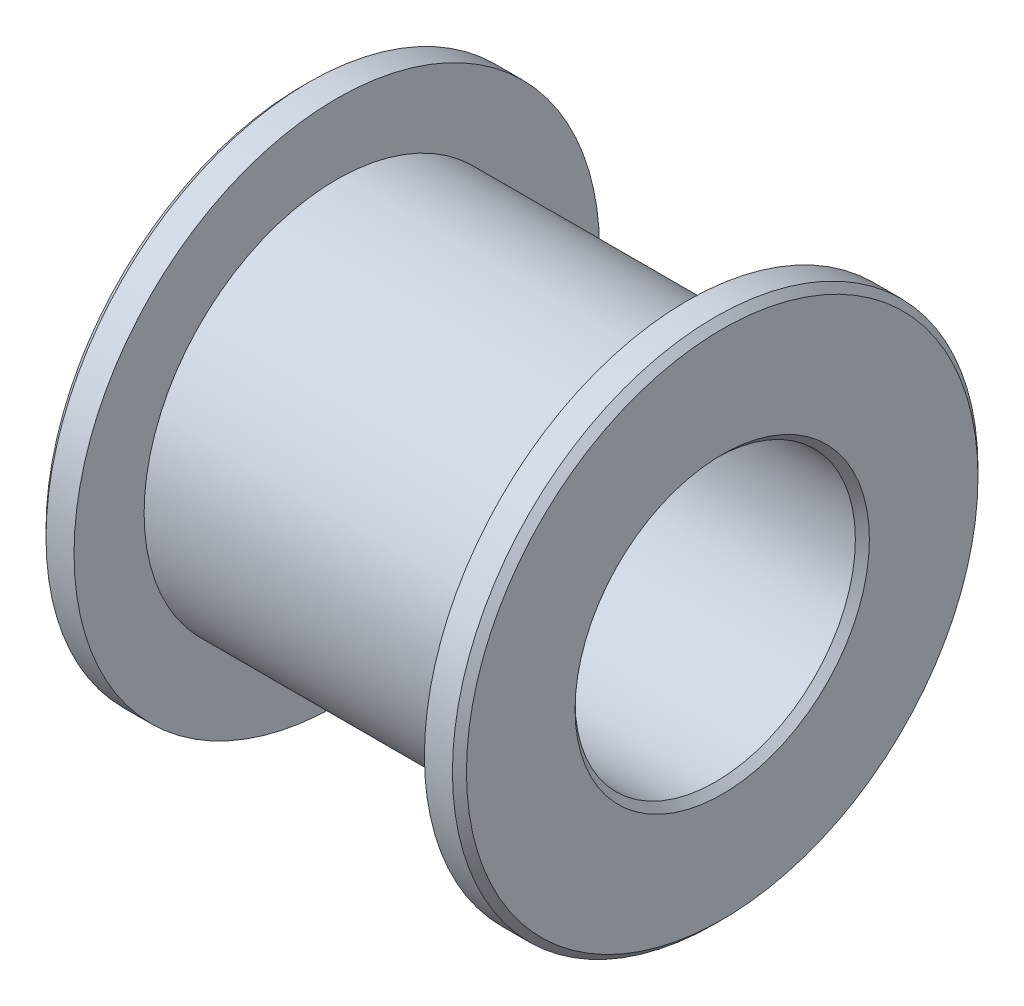
ISO-10303-21;
HEADER;
FILE_DESCRIPTION(('STEP AP214'),'2;1');
FILE_NAME('part.step','',(''),(''),'','','');
FILE_SCHEMA(('AUTOMOTIVE_DESIGN { 1 0 10303 214 1 1 1 1 }'));
ENDSEC;
DATA;
#1=APPLICATION_CONTEXT('core data for automotive mechanical design processes');
#2=APPLICATION_PROTOCOL_DEFINITION('international standard','automotive_design',2000,#1);
#3=PRODUCT_CONTEXT('',#1,'mechanical');
#4=PRODUCT('Part','Part','',(#3));
#5=PRODUCT_RELATED_PRODUCT_CATEGORY('part','',(#4));
#6=PRODUCT_DEFINITION_FORMATION('','',#4);
#7=PRODUCT_DEFINITION_CONTEXT('part definition',#1,'design');
#8=PRODUCT_DEFINITION('design','',#6,#7);
#9=PRODUCT_DEFINITION_SHAPE('','',#8);
#10=(LENGTH_UNIT() NAMED_UNIT(*) SI_UNIT(.MILLI.,.METRE.));
#11=(NAMED_UNIT(*) PLANE_ANGLE_UNIT() SI_UNIT($,.RADIAN.));
#12=(NAMED_UNIT(*) SI_UNIT($,.STERADIAN.) SOLID_ANGLE_UNIT());
#13=UNCERTAINTY_MEASURE_WITH_UNIT(LENGTH_MEASURE(1.E-05),#10,'distance_accuracy_value','');
#14=(GEOMETRIC_REPRESENTATION_CONTEXT(3) GLOBAL_UNCERTAINTY_ASSIGNED_CONTEXT((#13)) GLOBAL_UNIT_ASSIGNED_CONTEXT((#10,
#11,#12)) REPRESENTATION_CONTEXT('',''));
#15=CARTESIAN_POINT('',(0.,0.,0.));
#16=DIRECTION('',(0.,0.,1.));
#17=DIRECTION('',(1.,0.,0.));
#18=AXIS2_PLACEMENT_3D('',#15,#16,#17);
#19=CARTESIAN_POINT('',(-6.,0.,0.));
#20=DIRECTION('',(-1.,0.,0.));
#21=DIRECTION('',(0.,0.,1.));
#22=AXIS2_PLACEMENT_3D('',#19,#20,#21);
#23=CYLINDRICAL_SURFACE('',#22,5.5);
#24=CARTESIAN_POINT('',(0.,-3.83257569495583,3.94478941674125));
#25=CARTESIAN_POINT('',(0.0825564510277457,-3.83257779184317,3.94478849923233));
#26=CARTESIAN_POINT('',(0.16513210995551,-3.83768657177446,3.93984343512826));
#27=CARTESIAN_POINT('',(0.327893525300006,-3.85779985809754,3.92014947845345));
#28=CARTESIAN_POINT('',(0.408078135498548,-3.87280903328307,3.90539596042047));
#29=CARTESIAN_POINT('',(0.563679187961851,-3.91177142994483,3.86636748364182));
#30=CARTESIAN_POINT('',(0.639102360904223,-3.93571167988186,3.84210633126646));
#31=CARTESIAN_POINT('',(0.783358134236701,-3.99119472858773,3.78443644979051));
#32=CARTESIAN_POINT('',(0.852190136237295,-4.02273821671555,3.7510268911986));
#33=CARTESIAN_POINT('',(0.983110206791341,-4.09265249494127,3.67463366794366));
#34=CARTESIAN_POINT('',(1.04500032837805,-4.13116708301854,3.63144229944174));
#35=CARTESIAN_POINT('',(1.15852765772549,-4.21264703857915,3.53659550067493));
#36=CARTESIAN_POINT('',(1.21016376091601,-4.25561288479744,3.48493915964987));
#37=CARTESIAN_POINT('',(1.30254862681048,-4.34483481221414,3.37307079648808));
#38=CARTESIAN_POINT('',(1.34309972182645,-4.39113406996652,3.31272951759214));
#39=CARTESIAN_POINT('',(1.41087286818287,-4.48435294719107,3.18540330756704));
#40=CARTESIAN_POINT('',(1.43809727457422,-4.53127245554832,3.11841955279337));
#41=CARTESIAN_POINT('',(1.47780109828054,-4.62271849092706,2.9811258261359));
#42=CARTESIAN_POINT('',(1.49061744421473,-4.66727541013824,2.91093364868071));
#43=CARTESIAN_POINT('',(1.50220230229795,-4.75359168787942,2.76773372344523));
#44=CARTESIAN_POINT('',(1.50097326954448,-4.79535153404728,2.69472646995676));
#45=CARTESIAN_POINT('',(1.4847376013516,-4.87379253324529,2.55004783493598));
#46=CARTESIAN_POINT('',(1.47009512668074,-4.91057857065796,2.47839199233658));
#47=CARTESIAN_POINT('',(1.42803766765441,-4.97958496772767,2.3366537172284));
#48=CARTESIAN_POINT('',(1.40062193867166,-5.01180506106644,2.2665713766979));
#49=CARTESIAN_POINT('',(1.33352286415698,-5.07161811280774,2.12940152962072));
#50=CARTESIAN_POINT('',(1.2937165513123,-5.09916021069649,2.0623521227574));
#51=CARTESIAN_POINT('',(1.2030611057326,-5.14918273732886,1.93407963863881));
#52=CARTESIAN_POINT('',(1.15220973562866,-5.17166213865305,1.87285774546715));
#53=CARTESIAN_POINT('',(1.03898200487914,-5.21241257394092,1.75632900786158));
#54=CARTESIAN_POINT('',(0.976288328059216,-5.23052551927844,1.70127483626013));
#55=CARTESIAN_POINT('',(0.842154784886653,-5.26196774843585,1.6013884873768));
#56=CARTESIAN_POINT('',(0.770714333813611,-5.27529671221295,1.55655699405333));
#57=CARTESIAN_POINT('',(0.62044560599964,-5.2976737905369,1.47861926521595));
#58=CARTESIAN_POINT('',(0.541570994225794,-5.30669259484379,1.4455936849244));
#59=CARTESIAN_POINT('',(0.379077397770891,-5.32069441111388,1.39318165748244));
#60=CARTESIAN_POINT('',(0.295459658367184,-5.32567847717164,1.37379164814821));
#61=CARTESIAN_POINT('',(0.128647818490018,-5.33176511115863,1.34997343711764));
#62=CARTESIAN_POINT('',(0.0455218132358918,-5.3329838674859,1.34509754334896));
#63=CARTESIAN_POINT('',(-0.120351143542063,-5.33192993492103,1.34926947436423));
#64=CARTESIAN_POINT('',(-0.203098136486285,-5.32965763714367,1.3583157394011));
#65=CARTESIAN_POINT('',(-0.364122437311363,-5.32159308032032,1.389566813264));
#66=CARTESIAN_POINT('',(-0.442456420629789,-5.31587334351316,1.41150028662097));
#67=CARTESIAN_POINT('',(-0.594346009930619,-5.30072833446568,1.46734823631553));
#68=CARTESIAN_POINT('',(-0.667900969377689,-5.29130256206169,1.50126432975554));
#69=CARTESIAN_POINT('',(-0.810000708166988,-5.26814066052611,1.58064407405473));
#70=CARTESIAN_POINT('',(-0.878392574504979,-5.25431094924648,1.62635390892326));
#71=CARTESIAN_POINT('',(-1.00656606538514,-5.22201529862214,1.72723943956769));
#72=CARTESIAN_POINT('',(-1.06634599010013,-5.20354844596504,1.78241699938923));
#73=CARTESIAN_POINT('',(-1.1774663639506,-5.16099178744657,1.90218730711986));
#74=CARTESIAN_POINT('',(-1.2284950034342,-5.13674810887495,1.96701528554917));
#75=CARTESIAN_POINT('',(-1.31837063509098,-5.08276687255975,2.10256866694204));
#76=CARTESIAN_POINT('',(-1.35721827532782,-5.05302960722435,2.17329375590911));
#77=CARTESIAN_POINT('',(-1.42126706625792,-4.98841794761999,2.31773412983819));
#78=CARTESIAN_POINT('',(-1.44657089030049,-4.95358482891295,2.39142222867928));
#79=CARTESIAN_POINT('',(-1.48310695254508,-4.87913875030187,2.53986026370147));
#80=CARTESIAN_POINT('',(-1.49434246382693,-4.83952690455033,2.61460994880349));
#81=CARTESIAN_POINT('',(-1.50221012009057,-4.75784127197925,2.76038132972215));
#82=CARTESIAN_POINT('',(-1.49929867130671,-4.71588704715573,2.83144573146195));
#83=CARTESIAN_POINT('',(-1.48002022269001,-4.62969748531677,2.97028243750669));
#84=CARTESIAN_POINT('',(-1.46365377006972,-4.58546224113854,3.03805487557647));
#85=CARTESIAN_POINT('',(-1.41819262966053,-4.49659898831466,3.1680843493329));
#86=CARTESIAN_POINT('',(-1.38919430175976,-4.45197641180414,3.23037893053933));
#87=CARTESIAN_POINT('',(-1.3193783784649,-4.36367807066707,3.34869669213298));
#88=CARTESIAN_POINT('',(-1.27855906819338,-4.32000244440403,3.40471896095561));
#89=CARTESIAN_POINT('',(-1.1849452717183,-4.23415532924359,3.51094358956479));
#90=CARTESIAN_POINT('',(-1.13185092756335,-4.19205880123145,3.5609422429786));
#91=CARTESIAN_POINT('',(-1.01575786144977,-4.11255082675171,3.65247989433586));
#92=CARTESIAN_POINT('',(-0.952756497048733,-4.07514063504016,3.69401662847581));
#93=CARTESIAN_POINT('',(-0.816872473169076,-4.00601807281623,3.76888331769936));
#94=CARTESIAN_POINT('',(-0.743793797319194,-3.97445875509385,3.80199952684741));
#95=CARTESIAN_POINT('',(-0.590914054850382,-3.91992599330998,3.85820213250577));
#96=CARTESIAN_POINT('',(-0.511117229489693,-3.89694718133543,3.88129480115678));
#97=CARTESIAN_POINT('',(-0.359731980747443,-3.86374899765198,3.91432005982005));
#98=CARTESIAN_POINT('',(-0.288771531248475,-3.85210977434421,3.92573149072156));
#99=CARTESIAN_POINT('',(-0.145212202097287,-3.83652268745774,3.9409660925748));
#100=CARTESIAN_POINT('',(-0.0726135309486981,-3.83257385061306,3.94479022374739));
#101=CARTESIAN_POINT('',(0.,-3.83257569495583,3.94478941674125));
#102=B_SPLINE_CURVE_WITH_KNOTS('',3,(#24,#25,#26,#27,#28,#29,#30,#31,#32,#33,#34,#35,#36,#37,
#38,#39,#40,#41,#42,#43,#44,#45,#46,#47,#48,#49,#50,#51,#52,#53,#54,#55,#56,#57,#58,#59,#60,#61,
#62,#63,#64,#65,#66,#67,#68,#69,#70,#71,#72,#73,#74,#75,#76,#77,#78,#79,#80,#81,#82,#83,#84,#85,
#86,#87,#88,#89,#90,#91,#92,#93,#94,#95,#96,#97,#98,#99,#100,#101),.UNSPECIFIED.,.T.,.F.,(4,2,2,
2,2,2,2,2,2,2,2,2,2,2,2,2,2,2,2,2,2,2,2,2,2,2,2,2,2,2,2,2,2,2,2,2,2,2,4),(0.,0.247402201391968,
0.494921155336742,0.742082002291411,0.989265266888852,1.24229327000825,1.49534851471804,
1.75265882819585,2.00992365416646,2.26103843021061,2.51210931268384,2.75655962385663,
3.0010241872433,3.24799669713117,3.49501928234234,3.74996416866223,4.00492610732058,
4.26159801830625,4.51820285087414,4.76680611540842,5.01538153009582,5.25890187447337,
5.50245509545498,5.75157425489228,6.0007425183582,6.25748556676548,6.51421495339717,
6.76896951768223,7.02366480072505,7.27019876040454,7.51672269408902,7.76139812559489,
8.00610907011738,8.25758505394755,8.50912822664454,8.76653181226181,9.02377409687474,
9.24140725781327,9.45901287413893),.UNSPECIFIED.);
#103=CARTESIAN_POINT('',(0.,-3.83257569495583,3.94478941674125));
#104=VERTEX_POINT('',#103);
#105=EDGE_CURVE('E86',#104,#104,#102,.T.);
#106=ORIENTED_EDGE('',*,*,#105,.T.);
#107=EDGE_LOOP('',(#106));
#108=FACE_BOUND('',#107,.T.);
#109=CARTESIAN_POINT('',(-5.,0.,0.));
#110=DIRECTION('',(-1.,0.,0.));
#111=DIRECTION('',(0.,0.,1.));
#112=AXIS2_PLACEMENT_3D('',#109,#110,#111);
#113=CIRCLE('',#112,5.5);
#114=CARTESIAN_POINT('',(-5.,0.,5.5));
#115=VERTEX_POINT('',#114);
#116=EDGE_CURVE('E74',#115,#115,#113,.T.);
#117=ORIENTED_EDGE('',*,*,#116,.F.);
#118=EDGE_LOOP('',(#117));
#119=FACE_BOUND('',#118,.T.);
#120=CARTESIAN_POINT('',(5.,0.,0.));
#121=DIRECTION('',(-1.,0.,0.));
#122=DIRECTION('',(0.,0.,1.));
#123=AXIS2_PLACEMENT_3D('',#120,#121,#122);
#124=CIRCLE('',#123,5.5);
#125=CARTESIAN_POINT('',(5.,0.,5.5));
#126=VERTEX_POINT('',#125);
#127=EDGE_CURVE('E80',#126,#126,#124,.T.);
#128=ORIENTED_EDGE('',*,*,#127,.T.);
#129=EDGE_LOOP('',(#128));
#130=FACE_BOUND('',#129,.T.);
#131=ADVANCED_FACE('F36',(#108,#119,#130),#23,.T.);
#132=CARTESIAN_POINT('',(-5.,5.5,0.));
#133=DIRECTION('',(-1.,0.,0.));
#134=DIRECTION('',(0.,0.,1.));
#135=AXIS2_PLACEMENT_3D('',#132,#133,#134);
#136=PLANE('',#135);
#137=CARTESIAN_POINT('',(-5.,0.,0.));
#138=DIRECTION('',(-1.,0.,0.));
#139=DIRECTION('',(0.,0.,1.));
#140=AXIS2_PLACEMENT_3D('',#137,#138,#139);
#141=CIRCLE('',#140,7.5);
#142=CARTESIAN_POINT('',(-5.,0.,7.5));
#143=VERTEX_POINT('',#142);
#144=EDGE_CURVE('E77',#143,#143,#141,.T.);
#145=ORIENTED_EDGE('',*,*,#144,.F.);
#146=EDGE_LOOP('',(#145));
#147=FACE_BOUND('',#146,.T.);
#148=ORIENTED_EDGE('',*,*,#116,.T.);
#149=EDGE_LOOP('',(#148));
#150=FACE_BOUND('',#149,.T.);
#151=ADVANCED_FACE('F124',(#147,#150),#136,.F.);
#152=CARTESIAN_POINT('',(-6.,0.,0.));
#153=DIRECTION('',(-1.,0.,0.));
#154=DIRECTION('',(0.,0.,1.));
#155=AXIS2_PLACEMENT_3D('',#152,#153,#154);
#156=CYLINDRICAL_SURFACE('',#155,7.5);
#157=CARTESIAN_POINT('',(-5.8,0.,0.));
#158=DIRECTION('',(1.,0.,0.));
#159=DIRECTION('',(0.,0.,-1.));
#160=AXIS2_PLACEMENT_3D('',#157,#158,#159);
#161=CIRCLE('',#160,7.5);
#162=CARTESIAN_POINT('',(-5.8,0.,-7.5));
#163=VERTEX_POINT('',#162);
#164=EDGE_CURVE('E10',#163,#163,#161,.T.);
#165=ORIENTED_EDGE('',*,*,#164,.T.);
#166=EDGE_LOOP('',(#165));
#167=FACE_BOUND('',#166,.T.);
#168=ORIENTED_EDGE('',*,*,#144,.T.);
#169=EDGE_LOOP('',(#168));
#170=FACE_BOUND('',#169,.T.);
#171=ADVANCED_FACE('F121',(#167,#170),#156,.T.);
#172=CARTESIAN_POINT('',(-6.,7.5,0.));
#173=DIRECTION('',(1.,0.,0.));
#174=DIRECTION('',(0.,0.,-1.));
#175=AXIS2_PLACEMENT_3D('',#172,#173,#174);
#176=PLANE('',#175);
#177=CARTESIAN_POINT('',(-6.,0.,0.));
#178=DIRECTION('',(1.,0.,0.));
#179=DIRECTION('',(0.,0.,-1.));
#180=AXIS2_PLACEMENT_3D('',#177,#178,#179);
#181=CIRCLE('',#180,4.2);
#182=CARTESIAN_POINT('',(-6.,0.,-4.2));
#183=VERTEX_POINT('',#182);
#184=EDGE_CURVE('E54',#183,#183,#181,.T.);
#185=ORIENTED_EDGE('',*,*,#184,.T.);
#186=EDGE_LOOP('',(#185));
#187=FACE_BOUND('',#186,.T.);
#188=CARTESIAN_POINT('',(-6.,0.,0.));
#189=DIRECTION('',(1.,0.,0.));
#190=DIRECTION('',(0.,0.,-1.));
#191=AXIS2_PLACEMENT_3D('',#188,#189,#190);
#192=CIRCLE('',#191,7.3);
#193=CARTESIAN_POINT('',(-6.,0.,-7.3));
#194=VERTEX_POINT('',#193);
#195=EDGE_CURVE('E59',#194,#194,#192,.F.);
#196=ORIENTED_EDGE('',*,*,#195,.T.);
#197=EDGE_LOOP('',(#196));
#198=FACE_BOUND('',#197,.T.);
#199=ADVANCED_FACE('F117',(#187,#198),#176,.F.);
#200=CARTESIAN_POINT('',(5.,5.5,0.));
#201=DIRECTION('',(1.,0.,0.));
#202=DIRECTION('',(0.,0.,1.));
#203=AXIS2_PLACEMENT_3D('',#200,#201,#202);
#204=PLANE('',#203);
#205=CARTESIAN_POINT('',(5.,0.,0.));
#206=DIRECTION('',(-1.,0.,0.));
#207=DIRECTION('',(0.,0.,1.));
#208=AXIS2_PLACEMENT_3D('',#205,#206,#207);
#209=CIRCLE('',#208,7.5);
#210=CARTESIAN_POINT('',(5.,0.,7.5));
#211=VERTEX_POINT('',#210);
#212=EDGE_CURVE('E83',#211,#211,#209,.T.);
#213=ORIENTED_EDGE('',*,*,#212,.T.);
#214=EDGE_LOOP('',(#213));
#215=FACE_BOUND('',#214,.T.);
#216=ORIENTED_EDGE('',*,*,#127,.F.);
#217=EDGE_LOOP('',(#216));
#218=FACE_BOUND('',#217,.T.);
#219=ADVANCED_FACE('F113',(#215,#218),#204,.F.);
#220=CARTESIAN_POINT('',(6.,0.,0.));
#221=DIRECTION('',(1.,0.,0.));
#222=DIRECTION('',(0.,0.,1.));
#223=AXIS2_PLACEMENT_3D('',#220,#221,#222);
#224=CYLINDRICAL_SURFACE('',#223,7.5);
#225=CARTESIAN_POINT('',(5.8,0.,0.));
#226=DIRECTION('',(-1.,0.,0.));
#227=DIRECTION('',(0.,0.,1.));
#228=AXIS2_PLACEMENT_3D('',#225,#226,#227);
#229=CIRCLE('',#228,7.5);
#230=CARTESIAN_POINT('',(5.8,0.,7.5));
#231=VERTEX_POINT('',#230);
#232=EDGE_CURVE('E50',#231,#231,#229,.T.);
#233=ORIENTED_EDGE('',*,*,#232,.T.);
#234=EDGE_LOOP('',(#233));
#235=FACE_BOUND('',#234,.T.);
#236=ORIENTED_EDGE('',*,*,#212,.F.);
#237=EDGE_LOOP('',(#236));
#238=FACE_BOUND('',#237,.T.);
#239=ADVANCED_FACE('F109',(#235,#238),#224,.T.);
#240=CARTESIAN_POINT('',(6.,7.5,0.));
#241=DIRECTION('',(-1.,0.,0.));
#242=DIRECTION('',(0.,0.,-1.));
#243=AXIS2_PLACEMENT_3D('',#240,#241,#242);
#244=PLANE('',#243);
#245=CARTESIAN_POINT('',(6.,0.,0.));
#246=DIRECTION('',(-1.,0.,0.));
#247=DIRECTION('',(0.,0.,1.));
#248=AXIS2_PLACEMENT_3D('',#245,#246,#247);
#249=CIRCLE('',#248,4.2);
#250=CARTESIAN_POINT('',(6.,0.,4.2));
#251=VERTEX_POINT('',#250);
#252=EDGE_CURVE('E68',#251,#251,#249,.T.);
#253=ORIENTED_EDGE('',*,*,#252,.T.);
#254=EDGE_LOOP('',(#253));
#255=FACE_BOUND('',#254,.T.);
#256=CARTESIAN_POINT('',(6.,0.,0.));
#257=DIRECTION('',(-1.,0.,0.));
#258=DIRECTION('',(0.,0.,1.));
#259=AXIS2_PLACEMENT_3D('',#256,#257,#258);
#260=CIRCLE('',#259,7.3);
#261=CARTESIAN_POINT('',(6.,0.,7.3));
#262=VERTEX_POINT('',#261);
#263=EDGE_CURVE('E71',#262,#262,#260,.F.);
#264=ORIENTED_EDGE('',*,*,#263,.T.);
#265=EDGE_LOOP('',(#264));
#266=FACE_BOUND('',#265,.T.);
#267=ADVANCED_FACE('F105',(#255,#266),#244,.F.);
#268=CARTESIAN_POINT('',(6.,0.,0.));
#269=DIRECTION('',(-1.,0.,0.));
#270=DIRECTION('',(0.,0.,1.));
#271=AXIS2_PLACEMENT_3D('',#268,#269,#270);
#272=CYLINDRICAL_SURFACE('',#271,4.);
#273=CARTESIAN_POINT('',(0.,-2.46130814466628,3.15308772745058));
#274=CARTESIAN_POINT('',(-0.0810074837207897,-2.46130416703999,3.15308894248185));
#275=CARTESIAN_POINT('',(-0.161994922503636,-2.46692401386083,3.14872747440101));
#276=CARTESIAN_POINT('',(-0.321528082913202,-2.48893953169064,3.13135346024446));
#277=CARTESIAN_POINT('',(-0.400073877595011,-2.50533487996613,3.11834117326643));
#278=CARTESIAN_POINT('',(-0.552375371613527,-2.54763559103675,3.08387532277158));
#279=CARTESIAN_POINT('',(-0.626142056651083,-2.57351816157599,3.06244198133433));
#280=CARTESIAN_POINT('',(-0.76737189681884,-2.63314003803974,3.01133035480329));
#281=CARTESIAN_POINT('',(-0.83483315028252,-2.6668817035576,2.98164959300885));
#282=CARTESIAN_POINT('',(-0.964890311622817,-2.74204097254054,2.91271721243845));
#283=CARTESIAN_POINT('',(-1.02712852962939,-2.78373657182072,2.87309366119098));
#284=CARTESIAN_POINT('',(-1.14172281467149,-2.87154547447213,2.78533235454073));
#285=CARTESIAN_POINT('',(-1.19407677374185,-2.91765971703069,2.7371927872015));
#286=CARTESIAN_POINT('',(-1.28913951229561,-3.01376028398765,2.63107154503124));
#287=CARTESIAN_POINT('',(-1.33145947471586,-3.06382497112885,2.57281070897668));
#288=CARTESIAN_POINT('',(-1.40265117252491,-3.16397597332787,2.44859301974589));
#289=CARTESIAN_POINT('',(-1.43152757199197,-3.21406227484147,2.3826388456243));
#290=CARTESIAN_POINT('',(-1.47375789577462,-3.30985861192705,2.24753066034174));
#291=CARTESIAN_POINT('',(-1.48772762744046,-3.35566422563199,2.17863737235961));
#292=CARTESIAN_POINT('',(-1.50172120094499,-3.44342381167713,2.03709528834153));
#293=CARTESIAN_POINT('',(-1.50174957761871,-3.48537903203104,1.96444772118504));
#294=CARTESIAN_POINT('',(-1.48821823853483,-3.56215651743457,1.82134924536859));
#295=CARTESIAN_POINT('',(-1.47533070205119,-3.59722898362323,1.75096747383887));
#296=CARTESIAN_POINT('',(-1.43746408477445,-3.66204439904788,1.61101853992129));
#297=CARTESIAN_POINT('',(-1.41248414773796,-3.69178697067825,1.54145143557603));
#298=CARTESIAN_POINT('',(-1.35082954832415,-3.74615784257056,1.40421966684579));
#299=CARTESIAN_POINT('',(-1.31398999473159,-3.77070542200687,1.3365974181102));
#300=CARTESIAN_POINT('',(-1.22980790307061,-3.81438289074645,1.20632123821128));
#301=CARTESIAN_POINT('',(-1.1824619769824,-3.83351102788629,1.14366891858216));
#302=CARTESIAN_POINT('',(-1.07537271371681,-3.86785822217229,1.02172363584089));
#303=CARTESIAN_POINT('',(-1.01506608434957,-3.88278307121918,0.962841721157713));
#304=CARTESIAN_POINT('',(-0.885407006678441,-3.90798892180928,0.854813844924447));
#305=CARTESIAN_POINT('',(-0.816052293413361,-3.9182687577042,0.805670328923489));
#306=CARTESIAN_POINT('',(-0.668280532537177,-3.93525577063681,0.718191134485137));
#307=CARTESIAN_POINT('',(-0.589696506313933,-3.94187858478667,0.680119556887318));
#308=CARTESIAN_POINT('',(-0.426903774832427,-3.95205044065656,0.618296615287921));
#309=CARTESIAN_POINT('',(-0.342698228406309,-3.95560119322117,0.594537282976517));
#310=CARTESIAN_POINT('',(-0.176024037684047,-3.96011415400145,0.563673025953814));
#311=CARTESIAN_POINT('',(-0.093715894463859,-3.96120837256408,0.555721544182528));
#312=CARTESIAN_POINT('',(0.0710093567417423,-3.96139505428122,0.554393287633167));
#313=CARTESIAN_POINT('',(0.153426432352471,-3.96048801766269,0.561012870720206));
#314=CARTESIAN_POINT('',(0.31192992228768,-3.95660422459683,0.587748090151342));
#315=CARTESIAN_POINT('',(0.38813113576466,-3.95372775968472,0.607208165259563));
#316=CARTESIAN_POINT('',(0.536347944720194,-3.94559961270876,0.657950745391574));
#317=CARTESIAN_POINT('',(0.608362679168135,-3.94034744397206,0.68923567256969));
#318=CARTESIAN_POINT('',(0.749164438076205,-3.92662341308151,0.763613608674909));
#319=CARTESIAN_POINT('',(0.817729292137339,-3.91803824396033,0.807105273304065));
#320=CARTESIAN_POINT('',(0.947128981726039,-3.89691377193743,0.903603640175327));
#321=CARTESIAN_POINT('',(1.00796097462463,-3.88437302081242,0.956613824284626));
#322=CARTESIAN_POINT('',(1.1241683731951,-3.85363227625703,1.0739740348992));
#323=CARTESIAN_POINT('',(1.17895340876875,-3.83512392463583,1.13882989634834));
#324=CARTESIAN_POINT('',(1.27683836758944,-3.79201627396768,1.27503264962599));
#325=CARTESIAN_POINT('',(1.31993825294584,-3.76741695517046,1.3463795625016));
#326=CARTESIAN_POINT('',(1.39294605619961,-3.711791364052,1.49288848445759));
#327=CARTESIAN_POINT('',(1.4228991237926,-3.68078763446489,1.56803643199574));
#328=CARTESIAN_POINT('',(1.46865641384992,-3.61240518346287,1.71971941896856));
#329=CARTESIAN_POINT('',(1.4844672854224,-3.5750294677586,1.79625378927443));
#330=CARTESIAN_POINT('',(1.50077440275483,-3.49701542235705,1.94355975996712));
#331=CARTESIAN_POINT('',(1.50210948305899,-3.45669418700059,2.01440726096226));
#332=CARTESIAN_POINT('',(1.49158484055461,-3.3722592876295,2.15277337371414));
#333=CARTESIAN_POINT('',(1.47972670911414,-3.32814608159537,2.22029238592815));
#334=CARTESIAN_POINT('',(1.44374114850638,-3.23882359879593,2.34861476220779));
#335=CARTESIAN_POINT('',(1.41992009412164,-3.19366731525059,2.40954177507423));
#336=CARTESIAN_POINT('',(1.36098998661564,-3.10293681149968,2.52531146222657));
#337=CARTESIAN_POINT('',(1.32587879669525,-3.0573625137672,2.58015298211198));
#338=CARTESIAN_POINT('',(1.24368605649519,-2.96567401779907,2.68511428848657));
#339=CARTESIAN_POINT('',(1.19616335948585,-2.91961765634593,2.73493868271024));
#340=CARTESIAN_POINT('',(1.09119216981239,-2.83097524837746,2.8265971887372));
#341=CARTESIAN_POINT('',(1.03374013419212,-2.78839044858359,2.868428437194));
#342=CARTESIAN_POINT('',(0.906935868354939,-2.70661009558998,2.9457763929428));
#343=CARTESIAN_POINT('',(0.837115597845688,-2.66771204811978,2.98084329967611));
#344=CARTESIAN_POINT('',(0.689584130426674,-2.59834374399289,3.04150311994833));
#345=CARTESIAN_POINT('',(0.611872115946517,-2.56787436175086,3.06709505061834));
#346=CARTESIAN_POINT('',(0.447044319024593,-2.5164290803657,3.1094623762281));
#347=CARTESIAN_POINT('',(0.359665633488215,-2.49592793682217,3.12580206721063));
#348=CARTESIAN_POINT('',(0.181514728044213,-2.46837413297852,3.14761047631873));
#349=CARTESIAN_POINT('',(0.0907447872900077,-2.46131260041326,3.15308636636948));
#350=CARTESIAN_POINT('',(0.,-2.46130814466628,3.15308772745058));
#351=B_SPLINE_CURVE_WITH_KNOTS('',3,(#273,#274,#275,#276,#277,#278,#279,#280,#281,#282,#283,
#284,#285,#286,#287,#288,#289,#290,#291,#292,#293,#294,#295,#296,#297,#298,#299,#300,#301,#302,
#303,#304,#305,#306,#307,#308,#309,#310,#311,#312,#313,#314,#315,#316,#317,#318,#319,#320,#321,
#322,#323,#324,#325,#326,#327,#328,#329,#330,#331,#332,#333,#334,#335,#336,#337,#338,#339,#340,
#341,#342,#343,#344,#345,#346,#347,#348,#349,#350),.UNSPECIFIED.,.T.,.F.,(4,2,2,2,2,2,2,2,2,2,2,
2,2,2,2,2,2,2,2,2,2,2,2,2,2,2,2,2,2,2,2,2,2,2,2,2,2,2,4),(0.,0.24268454141617,0.485361814598854,
0.72745985675703,0.969630679682933,1.22274652401128,1.47591628822983,1.73770072136421,
1.9993942638133,2.24980018489679,2.50012465404857,2.73806472803194,2.97602165263335,
3.21744131210668,3.45893893628976,3.71456675065874,3.97025867827335,4.23162592252966,
4.49284751635474,4.73965657740485,4.98640395388884,5.22143845928199,5.45652113429526,
5.70041561005821,5.94439948466355,6.20385016993624,6.46330169650178,6.72185508890168,
6.98028685560127,7.22365720549936,7.46699820319479,7.7044027400389,7.94185223512831,
8.18928323676987,8.43680270894964,8.69738599542079,8.95799630544242,9.23003178870926,
9.50188762323053),.UNSPECIFIED.);
#352=CARTESIAN_POINT('',(0.,-2.46130814466628,3.15308772745058));
#353=VERTEX_POINT('',#352);
#354=EDGE_CURVE('E41',#353,#353,#351,.T.);
#355=ORIENTED_EDGE('',*,*,#354,.T.);
#356=EDGE_LOOP('',(#355));
#357=FACE_BOUND('',#356,.T.);
#358=CARTESIAN_POINT('',(5.8,0.,0.));
#359=DIRECTION('',(-1.,0.,0.));
#360=DIRECTION('',(0.,0.,1.));
#361=AXIS2_PLACEMENT_3D('',#358,#359,#360);
#362=CIRCLE('',#361,4.);
#363=CARTESIAN_POINT('',(5.8,0.,4.));
#364=VERTEX_POINT('',#363);
#365=EDGE_CURVE('E62',#364,#364,#362,.F.);
#366=ORIENTED_EDGE('',*,*,#365,.T.);
#367=EDGE_LOOP('',(#366));
#368=FACE_BOUND('',#367,.T.);
#369=CARTESIAN_POINT('',(-5.8,0.,0.));
#370=DIRECTION('',(1.,0.,0.));
#371=DIRECTION('',(0.,0.,-1.));
#372=AXIS2_PLACEMENT_3D('',#369,#370,#371);
#373=CIRCLE('',#372,4.);
#374=CARTESIAN_POINT('',(-5.8,0.,-4.));
#375=VERTEX_POINT('',#374);
#376=EDGE_CURVE('E65',#375,#375,#373,.F.);
#377=ORIENTED_EDGE('',*,*,#376,.T.);
#378=EDGE_LOOP('',(#377));
#379=FACE_BOUND('',#378,.T.);
#380=ADVANCED_FACE('F99',(#357,#368,#379),#272,.F.);
#381=CARTESIAN_POINT('',(6.,0.,0.));
#382=DIRECTION('',(1.,0.,0.));
#383=DIRECTION('',(0.,0.,-1.));
#384=AXIS2_PLACEMENT_3D('',#381,#382,#383);
#385=CONICAL_SURFACE('',#384,4.2,0.785398163397444);
#386=ORIENTED_EDGE('',*,*,#365,.F.);
#387=EDGE_LOOP('',(#386));
#388=FACE_BOUND('',#387,.T.);
#389=ORIENTED_EDGE('',*,*,#252,.F.);
#390=EDGE_LOOP('',(#389));
#391=FACE_BOUND('',#390,.T.);
#392=ADVANCED_FACE('F104',(#388,#391),#385,.F.);
#393=CARTESIAN_POINT('',(-6.,0.,0.));
#394=DIRECTION('',(-1.,0.,0.));
#395=DIRECTION('',(0.,0.,1.));
#396=AXIS2_PLACEMENT_3D('',#393,#394,#395);
#397=CONICAL_SURFACE('',#396,4.2,0.785398163397444);
#398=ORIENTED_EDGE('',*,*,#376,.F.);
#399=EDGE_LOOP('',(#398));
#400=FACE_BOUND('',#399,.T.);
#401=ORIENTED_EDGE('',*,*,#184,.F.);
#402=EDGE_LOOP('',(#401));
#403=FACE_BOUND('',#402,.T.);
#404=ADVANCED_FACE('F178',(#400,#403),#397,.F.);
#405=CARTESIAN_POINT('',(5.8,0.,0.));
#406=DIRECTION('',(-1.,0.,0.));
#407=DIRECTION('',(0.,0.,1.));
#408=AXIS2_PLACEMENT_3D('',#405,#406,#407);
#409=CONICAL_SURFACE('',#408,7.5,0.785398163397457);
#410=ORIENTED_EDGE('',*,*,#263,.F.);
#411=EDGE_LOOP('',(#410));
#412=FACE_BOUND('',#411,.T.);
#413=ORIENTED_EDGE('',*,*,#232,.F.);
#414=EDGE_LOOP('',(#413));
#415=FACE_BOUND('',#414,.T.);
#416=ADVANCED_FACE('F174',(#412,#415),#409,.T.);
#417=CARTESIAN_POINT('',(-6.,0.,0.));
#418=DIRECTION('',(1.,0.,0.));
#419=DIRECTION('',(0.,0.,-1.));
#420=AXIS2_PLACEMENT_3D('',#417,#418,#419);
#421=CONICAL_SURFACE('',#420,7.3,0.785398163397444);
#422=ORIENTED_EDGE('',*,*,#164,.F.);
#423=EDGE_LOOP('',(#422));
#424=FACE_BOUND('',#423,.T.);
#425=ORIENTED_EDGE('',*,*,#195,.F.);
#426=EDGE_LOOP('',(#425));
#427=FACE_BOUND('',#426,.T.);
#428=ADVANCED_FACE('F39',(#424,#427),#421,.T.);
#429=CARTESIAN_POINT('',(0.,-7.79422863405994,4.50000000000001));
#430=DIRECTION('',(0.,0.866025403784438,-0.500000000000001));
#431=DIRECTION('',(0.,0.500000000000001,0.866025403784438));
#432=AXIS2_PLACEMENT_3D('',#429,#430,#431);
#433=CYLINDRICAL_SURFACE('',#432,1.5);
#434=ORIENTED_EDGE('',*,*,#354,.F.);
#435=EDGE_LOOP('',(#434));
#436=FACE_BOUND('',#435,.T.);
#437=ORIENTED_EDGE('',*,*,#105,.F.);
#438=EDGE_LOOP('',(#437));
#439=FACE_BOUND('',#438,.T.);
#440=ADVANCED_FACE('F95',(#436,#439),#433,.F.);
#441=CLOSED_SHELL('',(#131,#151,#171,#199,#219,#239,#267,#380,#392,#404,#416,#428,#440));
#442=MANIFOLD_SOLID_BREP('B2',#441);
#443=ADVANCED_BREP_SHAPE_REPRESENTATION('',(#18,#442),#14);
#444=SHAPE_DEFINITION_REPRESENTATION(#9,#443);
ENDSEC;
END-ISO-10303-21;
